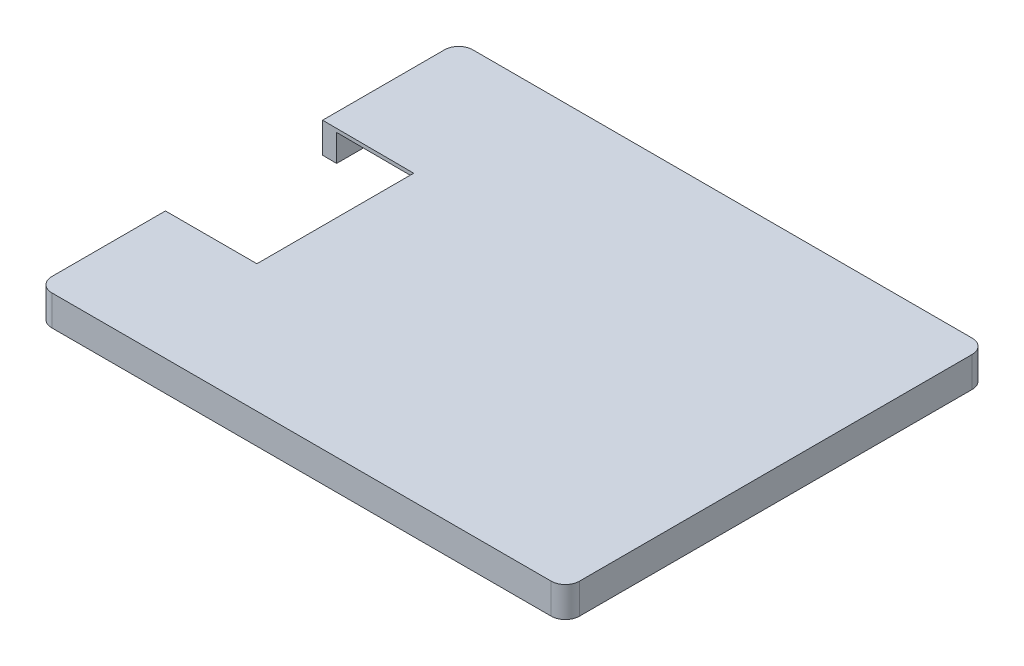
ISO-10303-21;
HEADER;
FILE_DESCRIPTION(('STEP AP214'),'2;1');
FILE_NAME('part.step','',(''),(''),'','','');
FILE_SCHEMA(('AUTOMOTIVE_DESIGN { 1 0 10303 214 1 1 1 1 }'));
ENDSEC;
DATA;
#1=APPLICATION_CONTEXT('core data for automotive mechanical design processes');
#2=APPLICATION_PROTOCOL_DEFINITION('international standard','automotive_design',2000,#1);
#3=PRODUCT_CONTEXT('',#1,'mechanical');
#4=PRODUCT('Part','Part','',(#3));
#5=PRODUCT_RELATED_PRODUCT_CATEGORY('part','',(#4));
#6=PRODUCT_DEFINITION_FORMATION('','',#4);
#7=PRODUCT_DEFINITION_CONTEXT('part definition',#1,'design');
#8=PRODUCT_DEFINITION('design','',#6,#7);
#9=PRODUCT_DEFINITION_SHAPE('','',#8);
#10=(LENGTH_UNIT() NAMED_UNIT(*) SI_UNIT(.MILLI.,.METRE.));
#11=(NAMED_UNIT(*) PLANE_ANGLE_UNIT() SI_UNIT($,.RADIAN.));
#12=(NAMED_UNIT(*) SI_UNIT($,.STERADIAN.) SOLID_ANGLE_UNIT());
#13=UNCERTAINTY_MEASURE_WITH_UNIT(LENGTH_MEASURE(1.E-05),#10,'distance_accuracy_value','');
#14=(GEOMETRIC_REPRESENTATION_CONTEXT(3) GLOBAL_UNCERTAINTY_ASSIGNED_CONTEXT((#13)) GLOBAL_UNIT_ASSIGNED_CONTEXT((#10,
#11,#12)) REPRESENTATION_CONTEXT('',''));
#15=CARTESIAN_POINT('',(0.,0.,0.));
#16=DIRECTION('',(0.,0.,1.));
#17=DIRECTION('',(1.,0.,0.));
#18=AXIS2_PLACEMENT_3D('',#15,#16,#17);
#19=CARTESIAN_POINT('',(0.,15.5,0.));
#20=DIRECTION('',(0.,1.,0.));
#21=DIRECTION('',(0.,0.,1.));
#22=AXIS2_PLACEMENT_3D('',#19,#20,#21);
#23=PLANE('',#22);
#24=DIRECTION('',(-1.,0.,0.));
#25=VECTOR('',#24,1.);
#26=CARTESIAN_POINT('',(71.7,15.5,-56.6));
#27=LINE('',#26,#25);
#28=CARTESIAN_POINT('',(69.7,15.5,-56.6));
#29=VERTEX_POINT('',#28);
#30=CARTESIAN_POINT('',(-1.00000000000001,15.5,-56.6));
#31=VERTEX_POINT('',#30);
#32=EDGE_CURVE('E207',#29,#31,#27,.T.);
#33=ORIENTED_EDGE('',*,*,#32,.F.);
#34=CARTESIAN_POINT('',(69.7,15.5,-54.6));
#35=DIRECTION('',(0.,1.,0.));
#36=DIRECTION('',(0.,0.,1.));
#37=AXIS2_PLACEMENT_3D('',#34,#35,#36);
#38=CIRCLE('',#37,2.);
#39=CARTESIAN_POINT('',(71.7,15.5,-54.6));
#40=VERTEX_POINT('',#39);
#41=EDGE_CURVE('E229',#29,#40,#38,.F.);
#42=ORIENTED_EDGE('',*,*,#41,.T.);
#43=DIRECTION('',(0.,0.,-1.));
#44=VECTOR('',#43,1.);
#45=CARTESIAN_POINT('',(71.7,15.5,3.));
#46=LINE('',#45,#44);
#47=CARTESIAN_POINT('',(71.7,15.5,1.));
#48=VERTEX_POINT('',#47);
#49=EDGE_CURVE('E215',#48,#40,#46,.T.);
#50=ORIENTED_EDGE('',*,*,#49,.F.);
#51=CARTESIAN_POINT('',(69.7,15.5,1.));
#52=DIRECTION('',(0.,1.,0.));
#53=DIRECTION('',(0.,0.,1.));
#54=AXIS2_PLACEMENT_3D('',#51,#52,#53);
#55=CIRCLE('',#54,2.);
#56=CARTESIAN_POINT('',(69.7,15.5,3.));
#57=VERTEX_POINT('',#56);
#58=EDGE_CURVE('E227',#48,#57,#55,.F.);
#59=ORIENTED_EDGE('',*,*,#58,.T.);
#60=DIRECTION('',(1.,0.,0.));
#61=VECTOR('',#60,1.);
#62=CARTESIAN_POINT('',(-3.,15.5,3.));
#63=LINE('',#62,#61);
#64=CARTESIAN_POINT('',(-1.,15.5,3.));
#65=VERTEX_POINT('',#64);
#66=EDGE_CURVE('E213',#65,#57,#63,.T.);
#67=ORIENTED_EDGE('',*,*,#66,.F.);
#68=CARTESIAN_POINT('',(-1.,15.5,1.));
#69=DIRECTION('',(0.,1.,0.));
#70=DIRECTION('',(0.,0.,1.));
#71=AXIS2_PLACEMENT_3D('',#68,#69,#70);
#72=CIRCLE('',#71,2.);
#73=CARTESIAN_POINT('',(-3.,15.5,1.));
#74=VERTEX_POINT('',#73);
#75=EDGE_CURVE('E223',#65,#74,#72,.F.);
#76=ORIENTED_EDGE('',*,*,#75,.T.);
#77=DIRECTION('',(0.,0.,1.));
#78=VECTOR('',#77,1.);
#79=CARTESIAN_POINT('',(-3.00000000000001,15.5,-56.6));
#80=LINE('',#79,#78);
#81=CARTESIAN_POINT('',(-3.00000000000001,15.5,-15.0849999999859));
#82=VERTEX_POINT('',#81);
#83=EDGE_CURVE('E210',#82,#74,#80,.T.);
#84=ORIENTED_EDGE('',*,*,#83,.F.);
#85=DIRECTION('',(1.,0.,0.));
#86=VECTOR('',#85,1.);
#87=CARTESIAN_POINT('',(-3.00000000000001,15.5,-15.0849999999859));
#88=LINE('',#87,#86);
#89=CARTESIAN_POINT('',(-1.00000000000001,15.5,-15.0849999999859));
#90=VERTEX_POINT('',#89);
#91=EDGE_CURVE('E169',#82,#90,#88,.T.);
#92=ORIENTED_EDGE('',*,*,#91,.T.);
#93=DIRECTION('',(0.,0.,1.));
#94=VECTOR('',#93,1.);
#95=CARTESIAN_POINT('',(-1.00000000000001,15.5,-54.6));
#96=LINE('',#95,#94);
#97=CARTESIAN_POINT('',(-1.00000000000001,15.5,1.));
#98=VERTEX_POINT('',#97);
#99=EDGE_CURVE('E187',#90,#98,#96,.T.);
#100=ORIENTED_EDGE('',*,*,#99,.T.);
#101=DIRECTION('',(1.,0.,0.));
#102=VECTOR('',#101,1.);
#103=CARTESIAN_POINT('',(-1.00000000000001,15.5,1.));
#104=LINE('',#103,#102);
#105=CARTESIAN_POINT('',(69.7,15.5,1.));
#106=VERTEX_POINT('',#105);
#107=EDGE_CURVE('E186',#98,#106,#104,.T.);
#108=ORIENTED_EDGE('',*,*,#107,.T.);
#109=DIRECTION('',(0.,0.,-1.));
#110=VECTOR('',#109,1.);
#111=CARTESIAN_POINT('',(69.7,15.5,1.));
#112=LINE('',#111,#110);
#113=CARTESIAN_POINT('',(69.7,15.5,-54.6));
#114=VERTEX_POINT('',#113);
#115=EDGE_CURVE('E283',#106,#114,#112,.T.);
#116=ORIENTED_EDGE('',*,*,#115,.T.);
#117=DIRECTION('',(-1.,0.,0.));
#118=VECTOR('',#117,1.);
#119=CARTESIAN_POINT('',(69.7,15.5,-54.6));
#120=LINE('',#119,#118);
#121=CARTESIAN_POINT('',(-1.00000000000001,15.5,-54.6));
#122=VERTEX_POINT('',#121);
#123=EDGE_CURVE('E185',#114,#122,#120,.T.);
#124=ORIENTED_EDGE('',*,*,#123,.T.);
#125=CARTESIAN_POINT('',(-1.00000000000001,15.5,-37.3268445115532));
#126=VERTEX_POINT('',#125);
#127=EDGE_CURVE('E177',#122,#126,#96,.T.);
#128=ORIENTED_EDGE('',*,*,#127,.T.);
#129=DIRECTION('',(-0.999991686104735,0.,-0.00407771031442588));
#130=VECTOR('',#129,1.);
#131=CARTESIAN_POINT('',(9.95000000000002,15.5,-37.282193212384));
#132=LINE('',#131,#130);
#133=CARTESIAN_POINT('',(-3.00000000000001,15.5,-37.3349999999859));
#134=VERTEX_POINT('',#133);
#135=EDGE_CURVE('E159',#126,#134,#132,.T.);
#136=ORIENTED_EDGE('',*,*,#135,.T.);
#137=CARTESIAN_POINT('',(-3.00000000000001,15.5,-54.6));
#138=VERTEX_POINT('',#137);
#139=EDGE_CURVE('E211',#138,#134,#80,.T.);
#140=ORIENTED_EDGE('',*,*,#139,.F.);
#141=CARTESIAN_POINT('',(-1.00000000000001,15.5,-54.6));
#142=DIRECTION('',(0.,1.,0.));
#143=DIRECTION('',(0.,0.,1.));
#144=AXIS2_PLACEMENT_3D('',#141,#142,#143);
#145=CIRCLE('',#144,2.);
#146=EDGE_CURVE('E225',#138,#31,#145,.F.);
#147=ORIENTED_EDGE('',*,*,#146,.T.);
#148=EDGE_LOOP('',(#33,#42,#50,#59,#67,#76,#84,#92,#100,#108,#116,#124,#128,#136,#140,#147));
#149=FACE_BOUND('',#148,.T.);
#150=ADVANCED_FACE('F33',(#149),#23,.F.);
#151=CARTESIAN_POINT('',(-3.00000000000001,19.3,-56.6));
#152=DIRECTION('',(1.,0.,0.));
#153=DIRECTION('',(0.,0.,-1.));
#154=AXIS2_PLACEMENT_3D('',#151,#152,#153);
#155=PLANE('',#154);
#156=DIRECTION('',(0.,0.,-1.));
#157=VECTOR('',#156,1.);
#158=CARTESIAN_POINT('',(-3.,19.8,3.00000000000002));
#159=LINE('',#158,#157);
#160=CARTESIAN_POINT('',(-3.00000000000001,19.8,-37.3349999999859));
#161=VERTEX_POINT('',#160);
#162=CARTESIAN_POINT('',(-3.00000000000002,19.8,-54.6));
#163=VERTEX_POINT('',#162);
#164=EDGE_CURVE('E252',#161,#163,#159,.T.);
#165=ORIENTED_EDGE('',*,*,#164,.T.);
#166=DIRECTION('',(0.,-1.,0.));
#167=VECTOR('',#166,1.);
#168=CARTESIAN_POINT('',(-3.00000000000001,19.3,-54.6));
#169=LINE('',#168,#167);
#170=EDGE_CURVE('E41',#163,#138,#169,.T.);
#171=ORIENTED_EDGE('',*,*,#170,.T.);
#172=ORIENTED_EDGE('',*,*,#139,.T.);
#173=DIRECTION('',(0.,-1.,0.));
#174=VECTOR('',#173,1.);
#175=CARTESIAN_POINT('',(-3.00000000000001,19.801,-37.3349999999859));
#176=LINE('',#175,#174);
#177=EDGE_CURVE('E165',#161,#134,#176,.T.);
#178=ORIENTED_EDGE('',*,*,#177,.F.);
#179=EDGE_LOOP('',(#165,#171,#172,#178));
#180=FACE_BOUND('',#179,.T.);
#181=ADVANCED_FACE('F250',(#180),#155,.F.);
#182=ORIENTED_EDGE('',*,*,#83,.T.);
#183=DIRECTION('',(0.,-1.,0.));
#184=VECTOR('',#183,1.);
#185=CARTESIAN_POINT('',(-3.,19.3,1.));
#186=LINE('',#185,#184);
#187=CARTESIAN_POINT('',(-3.,19.8,1.));
#188=VERTEX_POINT('',#187);
#189=EDGE_CURVE('E11',#74,#188,#186,.F.);
#190=ORIENTED_EDGE('',*,*,#189,.T.);
#191=CARTESIAN_POINT('',(-3.00000000000001,19.8,-15.0849999999859));
#192=VERTEX_POINT('',#191);
#193=EDGE_CURVE('E284',#188,#192,#159,.T.);
#194=ORIENTED_EDGE('',*,*,#193,.T.);
#195=DIRECTION('',(0.,-1.,0.));
#196=VECTOR('',#195,1.);
#197=CARTESIAN_POINT('',(-3.00000000000001,19.801,-15.0849999999859));
#198=LINE('',#197,#196);
#199=EDGE_CURVE('E298',#192,#82,#198,.T.);
#200=ORIENTED_EDGE('',*,*,#199,.T.);
#201=EDGE_LOOP('',(#182,#190,#194,#200));
#202=FACE_BOUND('',#201,.T.);
#203=ADVANCED_FACE('F340',(#202),#155,.F.);
#204=CARTESIAN_POINT('',(-1.00000000000001,19.3,-54.6));
#205=DIRECTION('',(1.,0.,0.));
#206=DIRECTION('',(0.,0.,-1.));
#207=AXIS2_PLACEMENT_3D('',#204,#205,#206);
#208=PLANE('',#207);
#209=DIRECTION('',(0.,0.,1.));
#210=VECTOR('',#209,1.);
#211=CARTESIAN_POINT('',(-1.00000000000001,19.3,-54.6));
#212=LINE('',#211,#210);
#213=CARTESIAN_POINT('',(-1.00000000000001,19.3,-54.6));
#214=VERTEX_POINT('',#213);
#215=CARTESIAN_POINT('',(-1.00000000000001,19.3,-37.3268445115532));
#216=VERTEX_POINT('',#215);
#217=EDGE_CURVE('E179',#214,#216,#212,.T.);
#218=ORIENTED_EDGE('',*,*,#217,.T.);
#219=DIRECTION('',(0.,1.,0.));
#220=VECTOR('',#219,1.);
#221=CARTESIAN_POINT('',(-1.00000000000001,19.801,-37.3268445115532));
#222=LINE('',#221,#220);
#223=EDGE_CURVE('E162',#126,#216,#222,.T.);
#224=ORIENTED_EDGE('',*,*,#223,.F.);
#225=ORIENTED_EDGE('',*,*,#127,.F.);
#226=DIRECTION('',(0.,-1.,0.));
#227=VECTOR('',#226,1.);
#228=CARTESIAN_POINT('',(-1.00000000000001,19.3,-54.6));
#229=LINE('',#228,#227);
#230=EDGE_CURVE('E202',#214,#122,#229,.T.);
#231=ORIENTED_EDGE('',*,*,#230,.F.);
#232=EDGE_LOOP('',(#218,#224,#225,#231));
#233=FACE_BOUND('',#232,.T.);
#234=ADVANCED_FACE('F175',(#233),#208,.T.);
#235=ORIENTED_EDGE('',*,*,#99,.F.);
#236=DIRECTION('',(0.,-1.,0.));
#237=VECTOR('',#236,1.);
#238=CARTESIAN_POINT('',(-1.00000000000001,19.801,-15.0849999999859));
#239=LINE('',#238,#237);
#240=CARTESIAN_POINT('',(-1.00000000000001,19.3,-15.0849999999859));
#241=VERTEX_POINT('',#240);
#242=EDGE_CURVE('E181',#241,#90,#239,.T.);
#243=ORIENTED_EDGE('',*,*,#242,.F.);
#244=CARTESIAN_POINT('',(-1.00000000000001,19.3,1.));
#245=VERTEX_POINT('',#244);
#246=EDGE_CURVE('E280',#241,#245,#212,.T.);
#247=ORIENTED_EDGE('',*,*,#246,.T.);
#248=DIRECTION('',(0.,-1.,0.));
#249=VECTOR('',#248,1.);
#250=CARTESIAN_POINT('',(-1.00000000000001,19.3,1.));
#251=LINE('',#250,#249);
#252=EDGE_CURVE('E198',#245,#98,#251,.T.);
#253=ORIENTED_EDGE('',*,*,#252,.T.);
#254=EDGE_LOOP('',(#235,#243,#247,#253));
#255=FACE_BOUND('',#254,.T.);
#256=ADVANCED_FACE('F321',(#255),#208,.T.);
#257=CARTESIAN_POINT('',(-62.6020972785354,19.3,3.00000000000003));
#258=DIRECTION('',(0.,-1.,0.));
#259=DIRECTION('',(0.,0.,-1.));
#260=AXIS2_PLACEMENT_3D('',#257,#258,#259);
#261=PLANE('',#260);
#262=DIRECTION('',(0.,0.,1.));
#263=VECTOR('',#262,1.);
#264=CARTESIAN_POINT('',(9.95000000000009,19.3,-15.0849999999859));
#265=LINE('',#264,#263);
#266=CARTESIAN_POINT('',(9.95000000000002,19.3,-37.282193212384));
#267=VERTEX_POINT('',#266);
#268=CARTESIAN_POINT('',(9.95000000000009,19.3,-15.0849999999859));
#269=VERTEX_POINT('',#268);
#270=EDGE_CURVE('E306',#267,#269,#265,.T.);
#271=ORIENTED_EDGE('',*,*,#270,.F.);
#272=DIRECTION('',(0.999991686104735,0.,0.00407771031442588));
#273=VECTOR('',#272,1.);
#274=CARTESIAN_POINT('',(9.95000000000002,19.3,-37.282193212384));
#275=LINE('',#274,#273);
#276=EDGE_CURVE('E170',#216,#267,#275,.T.);
#277=ORIENTED_EDGE('',*,*,#276,.F.);
#278=ORIENTED_EDGE('',*,*,#217,.F.);
#279=DIRECTION('',(-1.,0.,0.));
#280=VECTOR('',#279,1.);
#281=CARTESIAN_POINT('',(69.7,19.3,-54.6));
#282=LINE('',#281,#280);
#283=CARTESIAN_POINT('',(69.7,19.3,-54.6));
#284=VERTEX_POINT('',#283);
#285=EDGE_CURVE('E277',#284,#214,#282,.T.);
#286=ORIENTED_EDGE('',*,*,#285,.F.);
#287=DIRECTION('',(0.,0.,-1.));
#288=VECTOR('',#287,1.);
#289=CARTESIAN_POINT('',(69.7,19.3,1.));
#290=LINE('',#289,#288);
#291=CARTESIAN_POINT('',(69.7,19.3,1.));
#292=VERTEX_POINT('',#291);
#293=EDGE_CURVE('E190',#292,#284,#290,.T.);
#294=ORIENTED_EDGE('',*,*,#293,.F.);
#295=DIRECTION('',(1.,0.,0.));
#296=VECTOR('',#295,1.);
#297=CARTESIAN_POINT('',(-1.00000000000001,19.3,1.));
#298=LINE('',#297,#296);
#299=EDGE_CURVE('E199',#245,#292,#298,.T.);
#300=ORIENTED_EDGE('',*,*,#299,.F.);
#301=ORIENTED_EDGE('',*,*,#246,.F.);
#302=DIRECTION('',(-1.,0.,0.));
#303=VECTOR('',#302,1.);
#304=CARTESIAN_POINT('',(-3.00000000000001,19.3,-15.0849999999859));
#305=LINE('',#304,#303);
#306=EDGE_CURVE('E272',#269,#241,#305,.T.);
#307=ORIENTED_EDGE('',*,*,#306,.F.);
#308=EDGE_LOOP('',(#271,#277,#278,#286,#294,#300,#301,#307));
#309=FACE_BOUND('',#308,.T.);
#310=ADVANCED_FACE('F335',(#309),#261,.T.);
#311=CARTESIAN_POINT('',(-62.6020972785354,19.8,3.00000000000003));
#312=DIRECTION('',(0.,1.,0.));
#313=DIRECTION('',(0.,0.,1.));
#314=AXIS2_PLACEMENT_3D('',#311,#312,#313);
#315=PLANE('',#314);
#316=DIRECTION('',(0.,0.,1.));
#317=VECTOR('',#316,1.);
#318=CARTESIAN_POINT('',(71.7,19.8,3.));
#319=LINE('',#318,#317);
#320=CARTESIAN_POINT('',(71.7,19.8,-54.6));
#321=VERTEX_POINT('',#320);
#322=CARTESIAN_POINT('',(71.7,19.8,1.));
#323=VERTEX_POINT('',#322);
#324=EDGE_CURVE('E268',#321,#323,#319,.T.);
#325=ORIENTED_EDGE('',*,*,#324,.F.);
#326=CARTESIAN_POINT('',(69.7,19.8,-54.6));
#327=DIRECTION('',(0.,1.,0.));
#328=DIRECTION('',(0.,0.,1.));
#329=AXIS2_PLACEMENT_3D('',#326,#327,#328);
#330=CIRCLE('',#329,2.);
#331=CARTESIAN_POINT('',(69.7,19.8,-56.6));
#332=VERTEX_POINT('',#331);
#333=EDGE_CURVE('E241',#321,#332,#330,.T.);
#334=ORIENTED_EDGE('',*,*,#333,.T.);
#335=DIRECTION('',(1.,0.,0.));
#336=VECTOR('',#335,1.);
#337=CARTESIAN_POINT('',(-62.6020972785354,19.8,-56.6));
#338=LINE('',#337,#336);
#339=CARTESIAN_POINT('',(-1.00000000000001,19.8,-56.6));
#340=VERTEX_POINT('',#339);
#341=EDGE_CURVE('E265',#340,#332,#338,.T.);
#342=ORIENTED_EDGE('',*,*,#341,.F.);
#343=CARTESIAN_POINT('',(-1.00000000000001,19.8,-54.6));
#344=DIRECTION('',(0.,1.,0.));
#345=DIRECTION('',(0.,0.,1.));
#346=AXIS2_PLACEMENT_3D('',#343,#344,#345);
#347=CIRCLE('',#346,2.);
#348=EDGE_CURVE('E237',#340,#163,#347,.T.);
#349=ORIENTED_EDGE('',*,*,#348,.T.);
#350=ORIENTED_EDGE('',*,*,#164,.F.);
#351=DIRECTION('',(-0.999991686104735,0.,-0.00407771031442588));
#352=VECTOR('',#351,1.);
#353=CARTESIAN_POINT('',(9.95000000000002,19.8,-37.282193212384));
#354=LINE('',#353,#352);
#355=CARTESIAN_POINT('',(9.95000000000002,19.8,-37.282193212384));
#356=VERTEX_POINT('',#355);
#357=EDGE_CURVE('E308',#356,#161,#354,.T.);
#358=ORIENTED_EDGE('',*,*,#357,.F.);
#359=DIRECTION('',(0.,0.,-1.));
#360=VECTOR('',#359,1.);
#361=CARTESIAN_POINT('',(9.95000000000009,19.8,-15.0849999999859));
#362=LINE('',#361,#360);
#363=CARTESIAN_POINT('',(9.95000000000009,19.8,-15.0849999999859));
#364=VERTEX_POINT('',#363);
#365=EDGE_CURVE('E180',#364,#356,#362,.T.);
#366=ORIENTED_EDGE('',*,*,#365,.F.);
#367=DIRECTION('',(1.,0.,0.));
#368=VECTOR('',#367,1.);
#369=CARTESIAN_POINT('',(-3.00000000000001,19.8,-15.0849999999859));
#370=LINE('',#369,#368);
#371=EDGE_CURVE('E291',#192,#364,#370,.T.);
#372=ORIENTED_EDGE('',*,*,#371,.F.);
#373=ORIENTED_EDGE('',*,*,#193,.F.);
#374=CARTESIAN_POINT('',(-1.,19.8,1.));
#375=DIRECTION('',(0.,1.,0.));
#376=DIRECTION('',(0.,0.,1.));
#377=AXIS2_PLACEMENT_3D('',#374,#375,#376);
#378=CIRCLE('',#377,2.);
#379=CARTESIAN_POINT('',(-1.,19.8,3.00000000000002));
#380=VERTEX_POINT('',#379);
#381=EDGE_CURVE('E55',#188,#380,#378,.T.);
#382=ORIENTED_EDGE('',*,*,#381,.T.);
#383=DIRECTION('',(1.,0.,0.));
#384=VECTOR('',#383,1.);
#385=CARTESIAN_POINT('',(-62.6020972785354,19.8,3.00000000000003));
#386=LINE('',#385,#384);
#387=CARTESIAN_POINT('',(69.7,19.8,3.));
#388=VERTEX_POINT('',#387);
#389=EDGE_CURVE('E267',#380,#388,#386,.T.);
#390=ORIENTED_EDGE('',*,*,#389,.T.);
#391=CARTESIAN_POINT('',(69.7,19.8,1.));
#392=DIRECTION('',(0.,1.,0.));
#393=DIRECTION('',(0.,0.,1.));
#394=AXIS2_PLACEMENT_3D('',#391,#392,#393);
#395=CIRCLE('',#394,2.);
#396=EDGE_CURVE('E239',#388,#323,#395,.T.);
#397=ORIENTED_EDGE('',*,*,#396,.T.);
#398=EDGE_LOOP('',(#325,#334,#342,#349,#350,#358,#366,#372,#373,#382,#390,#397));
#399=FACE_BOUND('',#398,.T.);
#400=ADVANCED_FACE('F263',(#399),#315,.T.);
#401=CARTESIAN_POINT('',(71.7,19.3,-56.6));
#402=DIRECTION('',(0.,0.,1.));
#403=DIRECTION('',(1.,0.,0.));
#404=AXIS2_PLACEMENT_3D('',#401,#402,#403);
#405=PLANE('',#404);
#406=ORIENTED_EDGE('',*,*,#341,.T.);
#407=DIRECTION('',(0.,-1.,0.));
#408=VECTOR('',#407,1.);
#409=CARTESIAN_POINT('',(69.7,19.3,-56.6));
#410=LINE('',#409,#408);
#411=EDGE_CURVE('E220',#332,#29,#410,.T.);
#412=ORIENTED_EDGE('',*,*,#411,.T.);
#413=ORIENTED_EDGE('',*,*,#32,.T.);
#414=DIRECTION('',(0.,-1.,0.));
#415=VECTOR('',#414,1.);
#416=CARTESIAN_POINT('',(-1.00000000000001,19.3,-56.6));
#417=LINE('',#416,#415);
#418=EDGE_CURVE('E218',#31,#340,#417,.F.);
#419=ORIENTED_EDGE('',*,*,#418,.T.);
#420=EDGE_LOOP('',(#406,#412,#413,#419));
#421=FACE_BOUND('',#420,.T.);
#422=ADVANCED_FACE('F258',(#421),#405,.F.);
#423=CARTESIAN_POINT('',(-3.,19.3,3.));
#424=DIRECTION('',(0.,0.,-1.));
#425=DIRECTION('',(-1.,0.,0.));
#426=AXIS2_PLACEMENT_3D('',#423,#424,#425);
#427=PLANE('',#426);
#428=ORIENTED_EDGE('',*,*,#66,.T.);
#429=DIRECTION('',(0.,-1.,0.));
#430=VECTOR('',#429,1.);
#431=CARTESIAN_POINT('',(69.7,19.3,3.));
#432=LINE('',#431,#430);
#433=EDGE_CURVE('E48',#57,#388,#432,.F.);
#434=ORIENTED_EDGE('',*,*,#433,.T.);
#435=ORIENTED_EDGE('',*,*,#389,.F.);
#436=DIRECTION('',(0.,-1.,0.));
#437=VECTOR('',#436,1.);
#438=CARTESIAN_POINT('',(-1.,19.3,3.));
#439=LINE('',#438,#437);
#440=EDGE_CURVE('E243',#380,#65,#439,.T.);
#441=ORIENTED_EDGE('',*,*,#440,.T.);
#442=EDGE_LOOP('',(#428,#434,#435,#441));
#443=FACE_BOUND('',#442,.T.);
#444=ADVANCED_FACE('F345',(#443),#427,.F.);
#445=CARTESIAN_POINT('',(71.7,19.3,3.));
#446=DIRECTION('',(-1.,0.,0.));
#447=DIRECTION('',(0.,0.,1.));
#448=AXIS2_PLACEMENT_3D('',#445,#446,#447);
#449=PLANE('',#448);
#450=ORIENTED_EDGE('',*,*,#49,.T.);
#451=DIRECTION('',(0.,-1.,0.));
#452=VECTOR('',#451,1.);
#453=CARTESIAN_POINT('',(71.7,19.3,-54.6));
#454=LINE('',#453,#452);
#455=EDGE_CURVE('E234',#40,#321,#454,.F.);
#456=ORIENTED_EDGE('',*,*,#455,.T.);
#457=ORIENTED_EDGE('',*,*,#324,.T.);
#458=DIRECTION('',(0.,-1.,0.));
#459=VECTOR('',#458,1.);
#460=CARTESIAN_POINT('',(71.7,19.3,1.));
#461=LINE('',#460,#459);
#462=EDGE_CURVE('E231',#323,#48,#461,.T.);
#463=ORIENTED_EDGE('',*,*,#462,.T.);
#464=EDGE_LOOP('',(#450,#456,#457,#463));
#465=FACE_BOUND('',#464,.T.);
#466=ADVANCED_FACE('F352',(#465),#449,.F.);
#467=CARTESIAN_POINT('',(69.7,19.3,1.));
#468=DIRECTION('',(-1.,0.,0.));
#469=DIRECTION('',(0.,0.,1.));
#470=AXIS2_PLACEMENT_3D('',#467,#468,#469);
#471=PLANE('',#470);
#472=ORIENTED_EDGE('',*,*,#115,.F.);
#473=DIRECTION('',(0.,-1.,0.));
#474=VECTOR('',#473,1.);
#475=CARTESIAN_POINT('',(69.7,19.3,1.));
#476=LINE('',#475,#474);
#477=EDGE_CURVE('E195',#292,#106,#476,.T.);
#478=ORIENTED_EDGE('',*,*,#477,.F.);
#479=ORIENTED_EDGE('',*,*,#293,.T.);
#480=DIRECTION('',(0.,-1.,0.));
#481=VECTOR('',#480,1.);
#482=CARTESIAN_POINT('',(69.7,19.3,-54.6));
#483=LINE('',#482,#481);
#484=EDGE_CURVE('E204',#284,#114,#483,.T.);
#485=ORIENTED_EDGE('',*,*,#484,.T.);
#486=EDGE_LOOP('',(#472,#478,#479,#485));
#487=FACE_BOUND('',#486,.T.);
#488=ADVANCED_FACE('F329',(#487),#471,.T.);
#489=CARTESIAN_POINT('',(69.7,19.3,-54.6));
#490=DIRECTION('',(0.,0.,1.));
#491=DIRECTION('',(1.,0.,0.));
#492=AXIS2_PLACEMENT_3D('',#489,#490,#491);
#493=PLANE('',#492);
#494=ORIENTED_EDGE('',*,*,#123,.F.);
#495=ORIENTED_EDGE('',*,*,#484,.F.);
#496=ORIENTED_EDGE('',*,*,#285,.T.);
#497=ORIENTED_EDGE('',*,*,#230,.T.);
#498=EDGE_LOOP('',(#494,#495,#496,#497));
#499=FACE_BOUND('',#498,.T.);
#500=ADVANCED_FACE('F332',(#499),#493,.T.);
#501=CARTESIAN_POINT('',(-1.00000000000001,19.3,1.));
#502=DIRECTION('',(0.,0.,-1.));
#503=DIRECTION('',(-1.,0.,0.));
#504=AXIS2_PLACEMENT_3D('',#501,#502,#503);
#505=PLANE('',#504);
#506=ORIENTED_EDGE('',*,*,#107,.F.);
#507=ORIENTED_EDGE('',*,*,#252,.F.);
#508=ORIENTED_EDGE('',*,*,#299,.T.);
#509=ORIENTED_EDGE('',*,*,#477,.T.);
#510=EDGE_LOOP('',(#506,#507,#508,#509));
#511=FACE_BOUND('',#510,.T.);
#512=ADVANCED_FACE('F326',(#511),#505,.T.);
#513=CARTESIAN_POINT('',(9.95000000000009,19.801,-15.0849999999859));
#514=DIRECTION('',(-1.,0.,0.));
#515=DIRECTION('',(0.,0.,1.));
#516=AXIS2_PLACEMENT_3D('',#513,#514,#515);
#517=PLANE('',#516);
#518=ORIENTED_EDGE('',*,*,#270,.T.);
#519=DIRECTION('',(0.,-1.,0.));
#520=VECTOR('',#519,1.);
#521=CARTESIAN_POINT('',(9.95000000000009,19.801,-15.0849999999859));
#522=LINE('',#521,#520);
#523=EDGE_CURVE('E300',#364,#269,#522,.T.);
#524=ORIENTED_EDGE('',*,*,#523,.F.);
#525=ORIENTED_EDGE('',*,*,#365,.T.);
#526=DIRECTION('',(0.,-1.,0.));
#527=VECTOR('',#526,1.);
#528=CARTESIAN_POINT('',(9.95000000000002,19.801,-37.282193212384));
#529=LINE('',#528,#527);
#530=EDGE_CURVE('E294',#356,#267,#529,.T.);
#531=ORIENTED_EDGE('',*,*,#530,.T.);
#532=EDGE_LOOP('',(#518,#524,#525,#531));
#533=FACE_BOUND('',#532,.T.);
#534=ADVANCED_FACE('F337',(#533),#517,.T.);
#535=CARTESIAN_POINT('',(9.95000000000002,19.801,-37.282193212384));
#536=DIRECTION('',(-0.00407771031442588,0.,0.999991686104735));
#537=DIRECTION('',(0.999991686104735,0.,0.00407771031442588));
#538=AXIS2_PLACEMENT_3D('',#535,#536,#537);
#539=PLANE('',#538);
#540=ORIENTED_EDGE('',*,*,#223,.T.);
#541=ORIENTED_EDGE('',*,*,#276,.T.);
#542=ORIENTED_EDGE('',*,*,#530,.F.);
#543=ORIENTED_EDGE('',*,*,#357,.T.);
#544=ORIENTED_EDGE('',*,*,#177,.T.);
#545=ORIENTED_EDGE('',*,*,#135,.F.);
#546=EDGE_LOOP('',(#540,#541,#542,#543,#544,#545));
#547=FACE_BOUND('',#546,.T.);
#548=ADVANCED_FACE('F161',(#547),#539,.T.);
#549=CARTESIAN_POINT('',(-3.00000000000001,19.801,-15.0849999999859));
#550=DIRECTION('',(0.,0.,-1.));
#551=DIRECTION('',(-1.,0.,0.));
#552=AXIS2_PLACEMENT_3D('',#549,#550,#551);
#553=PLANE('',#552);
#554=ORIENTED_EDGE('',*,*,#242,.T.);
#555=ORIENTED_EDGE('',*,*,#91,.F.);
#556=ORIENTED_EDGE('',*,*,#199,.F.);
#557=ORIENTED_EDGE('',*,*,#371,.T.);
#558=ORIENTED_EDGE('',*,*,#523,.T.);
#559=ORIENTED_EDGE('',*,*,#306,.T.);
#560=EDGE_LOOP('',(#554,#555,#556,#557,#558,#559));
#561=FACE_BOUND('',#560,.T.);
#562=ADVANCED_FACE('F314',(#561),#553,.T.);
#563=CARTESIAN_POINT('',(69.7,19.3,-54.6));
#564=DIRECTION('',(0.,-1.,0.));
#565=DIRECTION('',(0.,0.,-1.));
#566=AXIS2_PLACEMENT_3D('',#563,#564,#565);
#567=CYLINDRICAL_SURFACE('',#566,2.);
#568=ORIENTED_EDGE('',*,*,#333,.F.);
#569=ORIENTED_EDGE('',*,*,#455,.F.);
#570=ORIENTED_EDGE('',*,*,#41,.F.);
#571=ORIENTED_EDGE('',*,*,#411,.F.);
#572=EDGE_LOOP('',(#568,#569,#570,#571));
#573=FACE_BOUND('',#572,.T.);
#574=ADVANCED_FACE('F355',(#573),#567,.T.);
#575=CARTESIAN_POINT('',(69.7,19.3,1.));
#576=DIRECTION('',(0.,-1.,0.));
#577=DIRECTION('',(0.,0.,-1.));
#578=AXIS2_PLACEMENT_3D('',#575,#576,#577);
#579=CYLINDRICAL_SURFACE('',#578,2.);
#580=ORIENTED_EDGE('',*,*,#396,.F.);
#581=ORIENTED_EDGE('',*,*,#433,.F.);
#582=ORIENTED_EDGE('',*,*,#58,.F.);
#583=ORIENTED_EDGE('',*,*,#462,.F.);
#584=EDGE_LOOP('',(#580,#581,#582,#583));
#585=FACE_BOUND('',#584,.T.);
#586=ADVANCED_FACE('F350',(#585),#579,.T.);
#587=CARTESIAN_POINT('',(-1.00000000000001,19.3,-54.6));
#588=DIRECTION('',(0.,-1.,0.));
#589=DIRECTION('',(0.,0.,-1.));
#590=AXIS2_PLACEMENT_3D('',#587,#588,#589);
#591=CYLINDRICAL_SURFACE('',#590,2.);
#592=ORIENTED_EDGE('',*,*,#348,.F.);
#593=ORIENTED_EDGE('',*,*,#418,.F.);
#594=ORIENTED_EDGE('',*,*,#146,.F.);
#595=ORIENTED_EDGE('',*,*,#170,.F.);
#596=EDGE_LOOP('',(#592,#593,#594,#595));
#597=FACE_BOUND('',#596,.T.);
#598=ADVANCED_FACE('F261',(#597),#591,.T.);
#599=CARTESIAN_POINT('',(-1.,19.3,1.));
#600=DIRECTION('',(0.,-1.,0.));
#601=DIRECTION('',(0.,0.,-1.));
#602=AXIS2_PLACEMENT_3D('',#599,#600,#601);
#603=CYLINDRICAL_SURFACE('',#602,2.);
#604=ORIENTED_EDGE('',*,*,#381,.F.);
#605=ORIENTED_EDGE('',*,*,#189,.F.);
#606=ORIENTED_EDGE('',*,*,#75,.F.);
#607=ORIENTED_EDGE('',*,*,#440,.F.);
#608=EDGE_LOOP('',(#604,#605,#606,#607));
#609=FACE_BOUND('',#608,.T.);
#610=ADVANCED_FACE('F35',(#609),#603,.T.);
#611=CLOSED_SHELL('',(#150,#181,#203,#234,#256,#310,#400,#422,#444,#466,#488,#500,#512,#534,
#548,#562,#574,#586,#598,#610));
#612=MANIFOLD_SOLID_BREP('B2',#611);
#613=ADVANCED_BREP_SHAPE_REPRESENTATION('',(#18,#612),#14);
#614=SHAPE_DEFINITION_REPRESENTATION(#9,#613);
ENDSEC;
END-ISO-10303-21;
